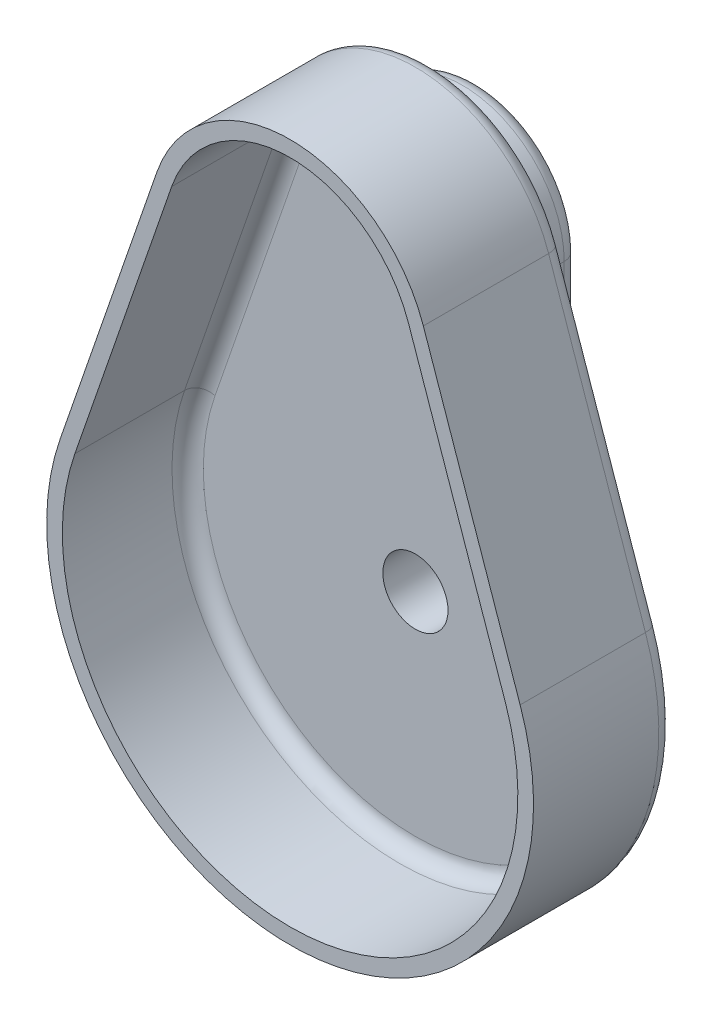
ISO-10303-21;
HEADER;
FILE_DESCRIPTION(('STEP AP214'),'2;1');
FILE_NAME('part.step','',(''),(''),'','','');
FILE_SCHEMA(('AUTOMOTIVE_DESIGN { 1 0 10303 214 1 1 1 1 }'));
ENDSEC;
DATA;
#1=APPLICATION_CONTEXT('core data for automotive mechanical design processes');
#2=APPLICATION_PROTOCOL_DEFINITION('international standard','automotive_design',2000,#1);
#3=PRODUCT_CONTEXT('',#1,'mechanical');
#4=PRODUCT('Part','Part','',(#3));
#5=PRODUCT_RELATED_PRODUCT_CATEGORY('part','',(#4));
#6=PRODUCT_DEFINITION_FORMATION('','',#4);
#7=PRODUCT_DEFINITION_CONTEXT('part definition',#1,'design');
#8=PRODUCT_DEFINITION('design','',#6,#7);
#9=PRODUCT_DEFINITION_SHAPE('','',#8);
#10=(LENGTH_UNIT() NAMED_UNIT(*) SI_UNIT(.MILLI.,.METRE.));
#11=(NAMED_UNIT(*) PLANE_ANGLE_UNIT() SI_UNIT($,.RADIAN.));
#12=(NAMED_UNIT(*) SI_UNIT($,.STERADIAN.) SOLID_ANGLE_UNIT());
#13=UNCERTAINTY_MEASURE_WITH_UNIT(LENGTH_MEASURE(1.E-05),#10,'distance_accuracy_value','');
#14=(GEOMETRIC_REPRESENTATION_CONTEXT(3) GLOBAL_UNCERTAINTY_ASSIGNED_CONTEXT((#13)) GLOBAL_UNIT_ASSIGNED_CONTEXT((#10,
#11,#12)) REPRESENTATION_CONTEXT('',''));
#15=CARTESIAN_POINT('',(0.,0.,0.));
#16=DIRECTION('',(0.,0.,1.));
#17=DIRECTION('',(1.,0.,0.));
#18=AXIS2_PLACEMENT_3D('',#15,#16,#17);
#19=CARTESIAN_POINT('',(0.,31.75,6.35));
#20=DIRECTION('',(0.,0.,-1.));
#21=DIRECTION('',(-1.,0.,0.));
#22=AXIS2_PLACEMENT_3D('',#19,#20,#21);
#23=CYLINDRICAL_SURFACE('',#22,10.31875);
#24=DIRECTION('',(0.,0.,-1.));
#25=VECTOR('',#24,1.);
#26=CARTESIAN_POINT('',(10.31875,31.75,6.35));
#27=LINE('',#26,#25);
#28=CARTESIAN_POINT('',(10.31875,31.75,3.175));
#29=VERTEX_POINT('',#28);
#30=CARTESIAN_POINT('',(10.31875,31.75,1.5875));
#31=VERTEX_POINT('',#30);
#32=EDGE_CURVE('E251',#29,#31,#27,.T.);
#33=ORIENTED_EDGE('',*,*,#32,.T.);
#34=CARTESIAN_POINT('',(0.,31.75,1.5875));
#35=DIRECTION('',(0.,0.,1.));
#36=DIRECTION('',(1.,0.,0.));
#37=AXIS2_PLACEMENT_3D('',#34,#35,#36);
#38=CIRCLE('',#37,10.31875);
#39=CARTESIAN_POINT('',(-10.31875,31.75,1.5875));
#40=VERTEX_POINT('',#39);
#41=EDGE_CURVE('E356',#31,#40,#38,.T.);
#42=ORIENTED_EDGE('',*,*,#41,.T.);
#43=DIRECTION('',(0.,0.,-1.));
#44=VECTOR('',#43,1.);
#45=CARTESIAN_POINT('',(-10.31875,31.75,6.35));
#46=LINE('',#45,#44);
#47=CARTESIAN_POINT('',(-10.31875,31.75,3.175));
#48=VERTEX_POINT('',#47);
#49=EDGE_CURVE('E259',#48,#40,#46,.T.);
#50=ORIENTED_EDGE('',*,*,#49,.F.);
#51=CARTESIAN_POINT('',(0.,31.75,3.175));
#52=DIRECTION('',(0.,0.,1.));
#53=DIRECTION('',(1.,0.,0.));
#54=AXIS2_PLACEMENT_3D('',#51,#52,#53);
#55=CIRCLE('',#54,10.31875);
#56=EDGE_CURVE('E307',#48,#29,#55,.F.);
#57=ORIENTED_EDGE('',*,*,#56,.T.);
#58=EDGE_LOOP('',(#33,#42,#50,#57));
#59=FACE_BOUND('',#58,.T.);
#60=ADVANCED_FACE('F46',(#59),#23,.T.);
#61=CARTESIAN_POINT('',(-10.31875,31.75,6.35));
#62=DIRECTION('',(1.,0.,0.));
#63=DIRECTION('',(0.,1.,0.));
#64=AXIS2_PLACEMENT_3D('',#61,#62,#63);
#65=PLANE('',#64);
#66=ORIENTED_EDGE('',*,*,#49,.T.);
#67=DIRECTION('',(0.,-1.,0.));
#68=VECTOR('',#67,1.);
#69=CARTESIAN_POINT('',(-10.31875,31.75,1.5875));
#70=LINE('',#69,#68);
#71=CARTESIAN_POINT('',(-10.31875,0.,1.5875));
#72=VERTEX_POINT('',#71);
#73=EDGE_CURVE('E315',#40,#72,#70,.T.);
#74=ORIENTED_EDGE('',*,*,#73,.T.);
#75=DIRECTION('',(0.,0.,-1.));
#76=VECTOR('',#75,1.);
#77=CARTESIAN_POINT('',(-10.31875,0.,6.35));
#78=LINE('',#77,#76);
#79=CARTESIAN_POINT('',(-10.31875,0.,3.175));
#80=VERTEX_POINT('',#79);
#81=EDGE_CURVE('E257',#80,#72,#78,.T.);
#82=ORIENTED_EDGE('',*,*,#81,.F.);
#83=DIRECTION('',(0.,-1.,0.));
#84=VECTOR('',#83,1.);
#85=CARTESIAN_POINT('',(-10.31875,31.75,3.175));
#86=LINE('',#85,#84);
#87=EDGE_CURVE('E305',#80,#48,#86,.F.);
#88=ORIENTED_EDGE('',*,*,#87,.T.);
#89=EDGE_LOOP('',(#66,#74,#82,#88));
#90=FACE_BOUND('',#89,.T.);
#91=ADVANCED_FACE('F387',(#90),#65,.F.);
#92=CARTESIAN_POINT('',(0.,0.,6.35));
#93=DIRECTION('',(0.,0.,-1.));
#94=DIRECTION('',(-1.,0.,0.));
#95=AXIS2_PLACEMENT_3D('',#92,#93,#94);
#96=CYLINDRICAL_SURFACE('',#95,10.31875);
#97=ORIENTED_EDGE('',*,*,#81,.T.);
#98=CARTESIAN_POINT('',(0.,0.,1.5875));
#99=DIRECTION('',(0.,0.,1.));
#100=DIRECTION('',(1.,0.,0.));
#101=AXIS2_PLACEMENT_3D('',#98,#99,#100);
#102=CIRCLE('',#101,10.31875);
#103=CARTESIAN_POINT('',(10.31875,0.,1.5875));
#104=VERTEX_POINT('',#103);
#105=EDGE_CURVE('E13',#72,#104,#102,.T.);
#106=ORIENTED_EDGE('',*,*,#105,.T.);
#107=DIRECTION('',(0.,0.,-1.));
#108=VECTOR('',#107,1.);
#109=CARTESIAN_POINT('',(10.31875,0.,6.35));
#110=LINE('',#109,#108);
#111=CARTESIAN_POINT('',(10.31875,0.,3.175));
#112=VERTEX_POINT('',#111);
#113=EDGE_CURVE('E255',#112,#104,#110,.T.);
#114=ORIENTED_EDGE('',*,*,#113,.F.);
#115=CARTESIAN_POINT('',(0.,0.,3.175));
#116=DIRECTION('',(0.,0.,1.));
#117=DIRECTION('',(1.,0.,0.));
#118=AXIS2_PLACEMENT_3D('',#115,#116,#117);
#119=CIRCLE('',#118,10.31875);
#120=EDGE_CURVE('E302',#112,#80,#119,.F.);
#121=ORIENTED_EDGE('',*,*,#120,.T.);
#122=EDGE_LOOP('',(#97,#106,#114,#121));
#123=FACE_BOUND('',#122,.T.);
#124=ADVANCED_FACE('F389',(#123),#96,.T.);
#125=CARTESIAN_POINT('',(10.31875,31.75,6.35));
#126=DIRECTION('',(-1.,0.,0.));
#127=DIRECTION('',(0.,-1.,0.));
#128=AXIS2_PLACEMENT_3D('',#125,#126,#127);
#129=PLANE('',#128);
#130=ORIENTED_EDGE('',*,*,#113,.T.);
#131=DIRECTION('',(0.,1.,0.));
#132=VECTOR('',#131,1.);
#133=CARTESIAN_POINT('',(10.31875,31.75,1.5875));
#134=LINE('',#133,#132);
#135=EDGE_CURVE('E55',#104,#31,#134,.T.);
#136=ORIENTED_EDGE('',*,*,#135,.T.);
#137=ORIENTED_EDGE('',*,*,#32,.F.);
#138=DIRECTION('',(0.,1.,0.));
#139=VECTOR('',#138,1.);
#140=CARTESIAN_POINT('',(10.31875,0.,3.175));
#141=LINE('',#140,#139);
#142=EDGE_CURVE('E313',#29,#112,#141,.F.);
#143=ORIENTED_EDGE('',*,*,#142,.T.);
#144=EDGE_LOOP('',(#130,#136,#137,#143));
#145=FACE_BOUND('',#144,.T.);
#146=ADVANCED_FACE('F661',(#145),#129,.F.);
#147=CARTESIAN_POINT('',(0.,31.75,6.35));
#148=DIRECTION('',(0.,0.,1.));
#149=DIRECTION('',(1.,0.,0.));
#150=AXIS2_PLACEMENT_3D('',#147,#148,#149);
#151=PLANE('',#150);
#152=CARTESIAN_POINT('',(9.08290304807061E-12,31.7500000000605,6.35));
#153=DIRECTION('',(0.,0.,1.));
#154=DIRECTION('',(1.,0.,0.));
#155=AXIS2_PLACEMENT_3D('',#152,#153,#154);
#156=CIRCLE('',#155,11.1125000000002);
#157=CARTESIAN_POINT('',(10.5015829594927,35.3837875000508,6.35));
#158=VERTEX_POINT('',#157);
#159=CARTESIAN_POINT('',(-10.5015829594726,35.3837875000566,6.35));
#160=VERTEX_POINT('',#159);
#161=EDGE_CURVE('E266',#158,#160,#156,.T.);
#162=ORIENTED_EDGE('',*,*,#161,.T.);
#163=DIRECTION('',(-0.326999999999642,-0.945024338311048,0.));
#164=VECTOR('',#163,1.);
#165=CARTESIAN_POINT('',(-20.3130618959114,7.02878324999242,6.35));
#166=LINE('',#165,#164);
#167=CARTESIAN_POINT('',(-20.3130618959114,7.02878324999241,6.35));
#168=VERTEX_POINT('',#167);
#169=EDGE_CURVE('E268',#160,#168,#166,.T.);
#170=ORIENTED_EDGE('',*,*,#169,.T.);
#171=CARTESIAN_POINT('',(0.,0.,6.35));
#172=DIRECTION('',(0.,0.,1.));
#173=DIRECTION('',(1.,0.,0.));
#174=AXIS2_PLACEMENT_3D('',#171,#172,#173);
#175=CIRCLE('',#174,21.49475);
#176=CARTESIAN_POINT('',(20.3130618959155,7.02878324998056,6.35));
#177=VERTEX_POINT('',#176);
#178=EDGE_CURVE('E262',#168,#177,#175,.T.);
#179=ORIENTED_EDGE('',*,*,#178,.T.);
#180=DIRECTION('',(-0.326999999999102,0.945024338311235,0.));
#181=VECTOR('',#180,1.);
#182=CARTESIAN_POINT('',(10.5015829594927,35.3837875000509,6.35));
#183=LINE('',#182,#181);
#184=EDGE_CURVE('E264',#177,#158,#183,.T.);
#185=ORIENTED_EDGE('',*,*,#184,.T.);
#186=EDGE_LOOP('',(#162,#170,#179,#185));
#187=FACE_BOUND('',#186,.T.);
#188=CARTESIAN_POINT('',(0.,0.,6.35));
#189=DIRECTION('',(0.,0.,1.));
#190=DIRECTION('',(1.,0.,0.));
#191=AXIS2_PLACEMENT_3D('',#188,#189,#190);
#192=CIRCLE('',#191,3.302);
#193=CARTESIAN_POINT('',(3.302,0.,6.35));
#194=VERTEX_POINT('',#193);
#195=EDGE_CURVE('E248',#194,#194,#192,.T.);
#196=ORIENTED_EDGE('',*,*,#195,.F.);
#197=EDGE_LOOP('',(#196));
#198=FACE_BOUND('',#197,.T.);
#199=CARTESIAN_POINT('',(0.,31.75,6.35));
#200=DIRECTION('',(0.,0.,1.));
#201=DIRECTION('',(1.,0.,0.));
#202=AXIS2_PLACEMENT_3D('',#199,#200,#201);
#203=CIRCLE('',#202,3.302);
#204=CARTESIAN_POINT('',(3.302,31.75,6.35));
#205=VERTEX_POINT('',#204);
#206=EDGE_CURVE('E242',#205,#205,#203,.T.);
#207=ORIENTED_EDGE('',*,*,#206,.F.);
#208=EDGE_LOOP('',(#207));
#209=FACE_BOUND('',#208,.T.);
#210=ADVANCED_FACE('F658',(#187,#198,#209),#151,.T.);
#211=CARTESIAN_POINT('',(0.,31.75,0.));
#212=DIRECTION('',(0.,0.,1.));
#213=DIRECTION('',(1.,0.,0.));
#214=AXIS2_PLACEMENT_3D('',#211,#212,#213);
#215=PLANE('',#214);
#216=CARTESIAN_POINT('',(0.,0.,0.));
#217=DIRECTION('',(0.,0.,1.));
#218=DIRECTION('',(1.,0.,0.));
#219=AXIS2_PLACEMENT_3D('',#216,#217,#218);
#220=CIRCLE('',#219,8.73125);
#221=CARTESIAN_POINT('',(8.73125,0.,0.));
#222=VERTEX_POINT('',#221);
#223=CARTESIAN_POINT('',(-8.73125,0.,0.));
#224=VERTEX_POINT('',#223);
#225=EDGE_CURVE('E347',#222,#224,#220,.F.);
#226=ORIENTED_EDGE('',*,*,#225,.T.);
#227=DIRECTION('',(0.,-1.,0.));
#228=VECTOR('',#227,1.);
#229=CARTESIAN_POINT('',(-8.73125,31.75,0.));
#230=LINE('',#229,#228);
#231=CARTESIAN_POINT('',(-8.73125,31.75,0.));
#232=VERTEX_POINT('',#231);
#233=EDGE_CURVE('E353',#224,#232,#230,.F.);
#234=ORIENTED_EDGE('',*,*,#233,.T.);
#235=CARTESIAN_POINT('',(0.,31.75,0.));
#236=DIRECTION('',(0.,0.,1.));
#237=DIRECTION('',(1.,0.,0.));
#238=AXIS2_PLACEMENT_3D('',#235,#236,#237);
#239=CIRCLE('',#238,8.73125);
#240=CARTESIAN_POINT('',(8.73125,31.75,0.));
#241=VERTEX_POINT('',#240);
#242=EDGE_CURVE('E351',#232,#241,#239,.F.);
#243=ORIENTED_EDGE('',*,*,#242,.T.);
#244=DIRECTION('',(0.,1.,0.));
#245=VECTOR('',#244,1.);
#246=CARTESIAN_POINT('',(8.73125,31.75,0.));
#247=LINE('',#246,#245);
#248=EDGE_CURVE('E349',#241,#222,#247,.F.);
#249=ORIENTED_EDGE('',*,*,#248,.T.);
#250=EDGE_LOOP('',(#226,#234,#243,#249));
#251=FACE_BOUND('',#250,.T.);
#252=CARTESIAN_POINT('',(0.,0.,0.));
#253=DIRECTION('',(0.,0.,1.));
#254=DIRECTION('',(1.,0.,0.));
#255=AXIS2_PLACEMENT_3D('',#252,#253,#254);
#256=CIRCLE('',#255,3.302);
#257=CARTESIAN_POINT('',(3.302,0.,0.));
#258=VERTEX_POINT('',#257);
#259=EDGE_CURVE('E245',#258,#258,#256,.T.);
#260=ORIENTED_EDGE('',*,*,#259,.T.);
#261=EDGE_LOOP('',(#260));
#262=FACE_BOUND('',#261,.T.);
#263=CARTESIAN_POINT('',(0.,31.75,0.));
#264=DIRECTION('',(0.,0.,1.));
#265=DIRECTION('',(1.,0.,0.));
#266=AXIS2_PLACEMENT_3D('',#263,#264,#265);
#267=CIRCLE('',#266,3.302);
#268=CARTESIAN_POINT('',(3.302,31.75,0.));
#269=VERTEX_POINT('',#268);
#270=EDGE_CURVE('E236',#269,#269,#267,.T.);
#271=ORIENTED_EDGE('',*,*,#270,.T.);
#272=EDGE_LOOP('',(#271));
#273=FACE_BOUND('',#272,.T.);
#274=ADVANCED_FACE('F377',(#251,#262,#273),#215,.F.);
#275=CARTESIAN_POINT('',(0.,0.,6.35));
#276=DIRECTION('',(0.,0.,-1.));
#277=DIRECTION('',(-1.,0.,0.));
#278=AXIS2_PLACEMENT_3D('',#275,#276,#277);
#279=CYLINDRICAL_SURFACE('',#278,3.302);
#280=ORIENTED_EDGE('',*,*,#195,.T.);
#281=EDGE_LOOP('',(#280));
#282=FACE_BOUND('',#281,.T.);
#283=ORIENTED_EDGE('',*,*,#259,.F.);
#284=EDGE_LOOP('',(#283));
#285=FACE_BOUND('',#284,.T.);
#286=ADVANCED_FACE('F676',(#282,#285),#279,.F.);
#287=CARTESIAN_POINT('',(0.,31.75,6.35));
#288=DIRECTION('',(0.,0.,-1.));
#289=DIRECTION('',(-1.,0.,0.));
#290=AXIS2_PLACEMENT_3D('',#287,#288,#289);
#291=CYLINDRICAL_SURFACE('',#290,3.302);
#292=ORIENTED_EDGE('',*,*,#206,.T.);
#293=EDGE_LOOP('',(#292));
#294=FACE_BOUND('',#293,.T.);
#295=ORIENTED_EDGE('',*,*,#270,.F.);
#296=EDGE_LOOP('',(#295));
#297=FACE_BOUND('',#296,.T.);
#298=ADVANCED_FACE('F650',(#294,#297),#291,.F.);
#299=CARTESIAN_POINT('',(9.08290304807061E-12,31.7500000000605,4.7625));
#300=DIRECTION('',(0.,0.,1.));
#301=DIRECTION('',(1.,0.,0.));
#302=AXIS2_PLACEMENT_3D('',#299,#300,#301);
#303=PLANE('',#302);
#304=CARTESIAN_POINT('',(0.,0.,4.7625));
#305=DIRECTION('',(0.,0.,1.));
#306=DIRECTION('',(1.,0.,0.));
#307=AXIS2_PLACEMENT_3D('',#304,#305,#306);
#308=CIRCLE('',#307,23.08225);
#309=CARTESIAN_POINT('',(21.8132880329845,7.54789574997914,4.7625));
#310=VERTEX_POINT('',#309);
#311=CARTESIAN_POINT('',(-21.8132880329802,7.54789574999185,4.7625));
#312=VERTEX_POINT('',#311);
#313=EDGE_CURVE('E289',#310,#312,#308,.F.);
#314=ORIENTED_EDGE('',*,*,#313,.T.);
#315=DIRECTION('',(-0.326999999999647,-0.945024338311046,0.));
#316=VECTOR('',#315,1.);
#317=CARTESIAN_POINT('',(-12.0018090965412,35.902900000056,4.7625));
#318=LINE('',#317,#316);
#319=CARTESIAN_POINT('',(-12.0018090965414,35.9029000000561,4.7625));
#320=VERTEX_POINT('',#319);
#321=EDGE_CURVE('E295',#312,#320,#318,.F.);
#322=ORIENTED_EDGE('',*,*,#321,.T.);
#323=CARTESIAN_POINT('',(9.08290304807061E-12,31.7500000000605,4.7625));
#324=DIRECTION('',(0.,0.,1.));
#325=DIRECTION('',(1.,0.,0.));
#326=AXIS2_PLACEMENT_3D('',#323,#324,#325);
#327=CIRCLE('',#326,12.7000000000002);
#328=CARTESIAN_POINT('',(12.001809096562,35.9029000000495,4.7625));
#329=VERTEX_POINT('',#328);
#330=EDGE_CURVE('E293',#320,#329,#327,.F.);
#331=ORIENTED_EDGE('',*,*,#330,.T.);
#332=DIRECTION('',(-0.326999999999097,0.945024338311237,0.));
#333=VECTOR('',#332,1.);
#334=CARTESIAN_POINT('',(21.8132880329845,7.54789574997914,4.7625));
#335=LINE('',#334,#333);
#336=EDGE_CURVE('E291',#329,#310,#335,.F.);
#337=ORIENTED_EDGE('',*,*,#336,.T.);
#338=EDGE_LOOP('',(#314,#322,#331,#337));
#339=FACE_BOUND('',#338,.T.);
#340=DIRECTION('',(0.,-1.,0.));
#341=VECTOR('',#340,1.);
#342=CARTESIAN_POINT('',(-11.90625,0.,4.7625));
#343=LINE('',#342,#341);
#344=CARTESIAN_POINT('',(-11.90625,31.75,4.7625));
#345=VERTEX_POINT('',#344);
#346=CARTESIAN_POINT('',(-11.90625,0.,4.7625));
#347=VERTEX_POINT('',#346);
#348=EDGE_CURVE('E284',#345,#347,#343,.T.);
#349=ORIENTED_EDGE('',*,*,#348,.T.);
#350=CARTESIAN_POINT('',(0.,0.,4.7625));
#351=DIRECTION('',(0.,0.,1.));
#352=DIRECTION('',(1.,0.,0.));
#353=AXIS2_PLACEMENT_3D('',#350,#351,#352);
#354=CIRCLE('',#353,11.90625);
#355=CARTESIAN_POINT('',(11.90625,0.,4.7625));
#356=VERTEX_POINT('',#355);
#357=EDGE_CURVE('E286',#347,#356,#354,.T.);
#358=ORIENTED_EDGE('',*,*,#357,.T.);
#359=DIRECTION('',(0.,1.,0.));
#360=VECTOR('',#359,1.);
#361=CARTESIAN_POINT('',(11.90625,31.75,4.7625));
#362=LINE('',#361,#360);
#363=CARTESIAN_POINT('',(11.90625,31.75,4.7625));
#364=VERTEX_POINT('',#363);
#365=EDGE_CURVE('E280',#356,#364,#362,.T.);
#366=ORIENTED_EDGE('',*,*,#365,.T.);
#367=CARTESIAN_POINT('',(0.,31.75,4.7625));
#368=DIRECTION('',(0.,0.,1.));
#369=DIRECTION('',(1.,0.,0.));
#370=AXIS2_PLACEMENT_3D('',#367,#368,#369);
#371=CIRCLE('',#370,11.90625);
#372=EDGE_CURVE('E282',#364,#345,#371,.T.);
#373=ORIENTED_EDGE('',*,*,#372,.T.);
#374=EDGE_LOOP('',(#349,#358,#366,#373));
#375=FACE_BOUND('',#374,.T.);
#376=ADVANCED_FACE('F404',(#339,#375),#303,.F.);
#377=CARTESIAN_POINT('',(9.08290304807061E-12,31.7500000000605,4.7625));
#378=DIRECTION('',(0.,0.,1.));
#379=DIRECTION('',(1.,0.,0.));
#380=AXIS2_PLACEMENT_3D('',#377,#378,#379);
#381=CYLINDRICAL_SURFACE('',#380,14.2875000000002);
#382=DIRECTION('',(0.,0.,1.));
#383=VECTOR('',#382,1.);
#384=CARTESIAN_POINT('',(13.502035233631,36.4220125000481,4.7625));
#385=LINE('',#384,#383);
#386=CARTESIAN_POINT('',(13.502035233631,36.4220125000481,6.35));
#387=VERTEX_POINT('',#386);
#388=CARTESIAN_POINT('',(13.5020352336309,36.422012500048,19.05));
#389=VERTEX_POINT('',#388);
#390=EDGE_CURVE('E234',#387,#389,#385,.T.);
#391=ORIENTED_EDGE('',*,*,#390,.F.);
#392=CARTESIAN_POINT('',(9.08290304807061E-12,31.7500000000605,6.35));
#393=DIRECTION('',(0.,0.,1.));
#394=DIRECTION('',(1.,0.,0.));
#395=AXIS2_PLACEMENT_3D('',#392,#393,#394);
#396=CIRCLE('',#395,14.2875000000002);
#397=CARTESIAN_POINT('',(-13.50203523361,36.4220125000555,6.35));
#398=VERTEX_POINT('',#397);
#399=EDGE_CURVE('E298',#387,#398,#396,.T.);
#400=ORIENTED_EDGE('',*,*,#399,.T.);
#401=DIRECTION('',(0.,0.,1.));
#402=VECTOR('',#401,1.);
#403=CARTESIAN_POINT('',(-13.50203523361,36.4220125000555,4.7625));
#404=LINE('',#403,#402);
#405=CARTESIAN_POINT('',(-13.5020352336101,36.4220125000555,19.05));
#406=VERTEX_POINT('',#405);
#407=EDGE_CURVE('E233',#398,#406,#404,.T.);
#408=ORIENTED_EDGE('',*,*,#407,.T.);
#409=CARTESIAN_POINT('',(9.08290304807061E-12,31.7500000000605,19.05));
#410=DIRECTION('',(0.,0.,1.));
#411=DIRECTION('',(1.,0.,0.));
#412=AXIS2_PLACEMENT_3D('',#409,#410,#411);
#413=CIRCLE('',#412,14.2875000000002);
#414=EDGE_CURVE('E205',#389,#406,#413,.T.);
#415=ORIENTED_EDGE('',*,*,#414,.F.);
#416=EDGE_LOOP('',(#391,#400,#408,#415));
#417=FACE_BOUND('',#416,.T.);
#418=ADVANCED_FACE('F629',(#417),#381,.T.);
#419=CARTESIAN_POINT('',(13.5020352336489,36.4220124999965,4.7625));
#420=DIRECTION('',(0.945024338311237,0.326999999999097,0.));
#421=DIRECTION('',(-0.326999999999097,0.945024338311237,0.));
#422=AXIS2_PLACEMENT_3D('',#419,#420,#421);
#423=PLANE('',#422);
#424=DIRECTION('',(0.,0.,1.));
#425=VECTOR('',#424,1.);
#426=CARTESIAN_POINT('',(23.3135141700536,8.0670082499777,4.7625));
#427=LINE('',#426,#425);
#428=CARTESIAN_POINT('',(23.3135141700536,8.0670082499777,6.35));
#429=VERTEX_POINT('',#428);
#430=CARTESIAN_POINT('',(23.3135141700536,8.06700824997771,19.05));
#431=VERTEX_POINT('',#430);
#432=EDGE_CURVE('E237',#429,#431,#427,.T.);
#433=ORIENTED_EDGE('',*,*,#432,.F.);
#434=DIRECTION('',(-0.326999999999097,0.945024338311237,0.));
#435=VECTOR('',#434,1.);
#436=CARTESIAN_POINT('',(13.502035233631,36.4220125000481,6.35));
#437=LINE('',#436,#435);
#438=EDGE_CURVE('E300',#429,#387,#437,.T.);
#439=ORIENTED_EDGE('',*,*,#438,.T.);
#440=ORIENTED_EDGE('',*,*,#390,.T.);
#441=DIRECTION('',(-0.326999999999101,0.945024338311235,0.));
#442=VECTOR('',#441,1.);
#443=CARTESIAN_POINT('',(23.3135141700536,8.06700824997771,19.05));
#444=LINE('',#443,#442);
#445=EDGE_CURVE('E230',#431,#389,#444,.T.);
#446=ORIENTED_EDGE('',*,*,#445,.F.);
#447=EDGE_LOOP('',(#433,#439,#440,#446));
#448=FACE_BOUND('',#447,.T.);
#449=ADVANCED_FACE('F618',(#448),#423,.T.);
#450=CARTESIAN_POINT('',(0.,0.,4.7625));
#451=DIRECTION('',(0.,0.,1.));
#452=DIRECTION('',(1.,0.,0.));
#453=AXIS2_PLACEMENT_3D('',#450,#451,#452);
#454=CYLINDRICAL_SURFACE('',#453,24.66975);
#455=DIRECTION('',(0.,0.,1.));
#456=VECTOR('',#455,1.);
#457=CARTESIAN_POINT('',(-23.3135141700489,8.06700824999128,4.7625));
#458=LINE('',#457,#456);
#459=CARTESIAN_POINT('',(-23.3135141700489,8.06700824999128,6.35));
#460=VERTEX_POINT('',#459);
#461=CARTESIAN_POINT('',(-23.3135141700489,8.06700824999128,19.05));
#462=VERTEX_POINT('',#461);
#463=EDGE_CURVE('E239',#460,#462,#458,.T.);
#464=ORIENTED_EDGE('',*,*,#463,.F.);
#465=CARTESIAN_POINT('',(0.,0.,6.35));
#466=DIRECTION('',(0.,0.,1.));
#467=DIRECTION('',(1.,0.,0.));
#468=AXIS2_PLACEMENT_3D('',#465,#466,#467);
#469=CIRCLE('',#468,24.66975);
#470=EDGE_CURVE('E311',#460,#429,#469,.T.);
#471=ORIENTED_EDGE('',*,*,#470,.T.);
#472=ORIENTED_EDGE('',*,*,#432,.T.);
#473=CARTESIAN_POINT('',(0.,0.,19.05));
#474=DIRECTION('',(0.,0.,1.));
#475=DIRECTION('',(1.,0.,0.));
#476=AXIS2_PLACEMENT_3D('',#473,#474,#475);
#477=CIRCLE('',#476,24.66975);
#478=EDGE_CURVE('E227',#462,#431,#477,.T.);
#479=ORIENTED_EDGE('',*,*,#478,.F.);
#480=EDGE_LOOP('',(#464,#471,#472,#479));
#481=FACE_BOUND('',#480,.T.);
#482=ADVANCED_FACE('F605',(#481),#454,.T.);
#483=CARTESIAN_POINT('',(-13.5020352336297,36.4220124999986,4.7625));
#484=DIRECTION('',(-0.945024338311046,0.326999999999647,0.));
#485=DIRECTION('',(-0.326999999999647,-0.945024338311046,0.));
#486=AXIS2_PLACEMENT_3D('',#483,#484,#485);
#487=PLANE('',#486);
#488=ORIENTED_EDGE('',*,*,#407,.F.);
#489=DIRECTION('',(-0.326999999999647,-0.945024338311046,0.));
#490=VECTOR('',#489,1.);
#491=CARTESIAN_POINT('',(-23.3135141700489,8.06700824999129,6.35));
#492=LINE('',#491,#490);
#493=EDGE_CURVE('E277',#398,#460,#492,.T.);
#494=ORIENTED_EDGE('',*,*,#493,.T.);
#495=ORIENTED_EDGE('',*,*,#463,.T.);
#496=DIRECTION('',(-0.326999999999642,-0.945024338311048,0.));
#497=VECTOR('',#496,1.);
#498=CARTESIAN_POINT('',(-13.5020352336101,36.4220125000555,19.05));
#499=LINE('',#498,#497);
#500=EDGE_CURVE('E224',#406,#462,#499,.T.);
#501=ORIENTED_EDGE('',*,*,#500,.F.);
#502=EDGE_LOOP('',(#488,#494,#495,#501));
#503=FACE_BOUND('',#502,.T.);
#504=ADVANCED_FACE('F594',(#503),#487,.T.);
#505=CARTESIAN_POINT('',(9.08290304807061E-12,31.7500000000605,19.05));
#506=DIRECTION('',(0.,0.,1.));
#507=DIRECTION('',(1.,0.,0.));
#508=AXIS2_PLACEMENT_3D('',#505,#506,#507);
#509=PLANE('',#508);
#510=ORIENTED_EDGE('',*,*,#414,.T.);
#511=ORIENTED_EDGE('',*,*,#500,.T.);
#512=ORIENTED_EDGE('',*,*,#478,.T.);
#513=ORIENTED_EDGE('',*,*,#445,.T.);
#514=EDGE_LOOP('',(#510,#511,#512,#513));
#515=FACE_BOUND('',#514,.T.);
#516=DIRECTION('',(-0.326999999999101,0.945024338311235,0.));
#517=VECTOR('',#516,1.);
#518=CARTESIAN_POINT('',(21.8132880329845,7.54789574997914,19.05));
#519=LINE('',#518,#517);
#520=CARTESIAN_POINT('',(21.8132880329845,7.54789574997914,19.05));
#521=VERTEX_POINT('',#520);
#522=CARTESIAN_POINT('',(12.0018090965618,35.9029000000494,19.05));
#523=VERTEX_POINT('',#522);
#524=EDGE_CURVE('E196',#521,#523,#519,.T.);
#525=ORIENTED_EDGE('',*,*,#524,.F.);
#526=CARTESIAN_POINT('',(0.,0.,19.05));
#527=DIRECTION('',(0.,0.,1.));
#528=DIRECTION('',(1.,0.,0.));
#529=AXIS2_PLACEMENT_3D('',#526,#527,#528);
#530=CIRCLE('',#529,23.08225);
#531=CARTESIAN_POINT('',(-21.8132880329802,7.54789574999184,19.05));
#532=VERTEX_POINT('',#531);
#533=EDGE_CURVE('E186',#532,#521,#530,.T.);
#534=ORIENTED_EDGE('',*,*,#533,.F.);
#535=DIRECTION('',(-0.326999999999642,-0.945024338311048,0.));
#536=VECTOR('',#535,1.);
#537=CARTESIAN_POINT('',(-12.0018090965414,35.9029000000561,19.05));
#538=LINE('',#537,#536);
#539=CARTESIAN_POINT('',(-12.0018090965414,35.9029000000561,19.05));
#540=VERTEX_POINT('',#539);
#541=EDGE_CURVE('E213',#540,#532,#538,.T.);
#542=ORIENTED_EDGE('',*,*,#541,.F.);
#543=CARTESIAN_POINT('',(9.08290304807061E-12,31.7500000000605,19.05));
#544=DIRECTION('',(0.,0.,1.));
#545=DIRECTION('',(1.,0.,0.));
#546=AXIS2_PLACEMENT_3D('',#543,#544,#545);
#547=CIRCLE('',#546,12.7000000000002);
#548=EDGE_CURVE('E211',#523,#540,#547,.T.);
#549=ORIENTED_EDGE('',*,*,#548,.F.);
#550=EDGE_LOOP('',(#525,#534,#542,#549));
#551=FACE_BOUND('',#550,.T.);
#552=ADVANCED_FACE('F209',(#515,#551),#509,.T.);
#553=CARTESIAN_POINT('',(0.,0.,19.05));
#554=DIRECTION('',(0.,0.,-1.));
#555=DIRECTION('',(-1.,0.,0.));
#556=AXIS2_PLACEMENT_3D('',#553,#554,#555);
#557=CYLINDRICAL_SURFACE('',#556,23.08225);
#558=DIRECTION('',(0.,0.,-1.));
#559=VECTOR('',#558,1.);
#560=CARTESIAN_POINT('',(21.8132880329845,7.54789574997914,19.05));
#561=LINE('',#560,#559);
#562=CARTESIAN_POINT('',(21.8132880329845,7.54789574997914,7.9375));
#563=VERTEX_POINT('',#562);
#564=EDGE_CURVE('E189',#521,#563,#561,.T.);
#565=ORIENTED_EDGE('',*,*,#564,.T.);
#566=CARTESIAN_POINT('',(0.,0.,7.9375));
#567=DIRECTION('',(0.,0.,1.));
#568=DIRECTION('',(1.,0.,0.));
#569=AXIS2_PLACEMENT_3D('',#566,#567,#568);
#570=CIRCLE('',#569,23.08225);
#571=CARTESIAN_POINT('',(-21.8132880329802,7.54789574999184,7.9375));
#572=VERTEX_POINT('',#571);
#573=EDGE_CURVE('E309',#563,#572,#570,.F.);
#574=ORIENTED_EDGE('',*,*,#573,.T.);
#575=DIRECTION('',(0.,0.,-1.));
#576=VECTOR('',#575,1.);
#577=CARTESIAN_POINT('',(-21.8132880329802,7.54789574999184,19.05));
#578=LINE('',#577,#576);
#579=EDGE_CURVE('E192',#532,#572,#578,.T.);
#580=ORIENTED_EDGE('',*,*,#579,.F.);
#581=ORIENTED_EDGE('',*,*,#533,.T.);
#582=EDGE_LOOP('',(#565,#574,#580,#581));
#583=FACE_BOUND('',#582,.T.);
#584=ADVANCED_FACE('F188',(#583),#557,.F.);
#585=CARTESIAN_POINT('',(21.8132880329845,7.54789574997914,19.05));
#586=DIRECTION('',(-0.945024338311235,-0.326999999999102,0.));
#587=DIRECTION('',(0.326999999999102,-0.945024338311235,0.));
#588=AXIS2_PLACEMENT_3D('',#585,#586,#587);
#589=PLANE('',#588);
#590=DIRECTION('',(0.,0.,-1.));
#591=VECTOR('',#590,1.);
#592=CARTESIAN_POINT('',(12.0018090965618,35.9029000000494,19.05));
#593=LINE('',#592,#591);
#594=CARTESIAN_POINT('',(12.0018090965618,35.9029000000494,7.9375));
#595=VERTEX_POINT('',#594);
#596=EDGE_CURVE('E206',#523,#595,#593,.T.);
#597=ORIENTED_EDGE('',*,*,#596,.T.);
#598=DIRECTION('',(-0.326999999999102,0.945024338311235,0.));
#599=VECTOR('',#598,1.);
#600=CARTESIAN_POINT('',(21.8132880329845,7.54789574997913,7.9375));
#601=LINE('',#600,#599);
#602=EDGE_CURVE('E204',#595,#563,#601,.F.);
#603=ORIENTED_EDGE('',*,*,#602,.T.);
#604=ORIENTED_EDGE('',*,*,#564,.F.);
#605=ORIENTED_EDGE('',*,*,#524,.T.);
#606=EDGE_LOOP('',(#597,#603,#604,#605));
#607=FACE_BOUND('',#606,.T.);
#608=ADVANCED_FACE('F201',(#607),#589,.T.);
#609=CARTESIAN_POINT('',(9.08290304807061E-12,31.7500000000605,19.05));
#610=DIRECTION('',(0.,0.,-1.));
#611=DIRECTION('',(-1.,0.,0.));
#612=AXIS2_PLACEMENT_3D('',#609,#610,#611);
#613=CYLINDRICAL_SURFACE('',#612,12.7000000000002);
#614=DIRECTION('',(0.,0.,-1.));
#615=VECTOR('',#614,1.);
#616=CARTESIAN_POINT('',(-12.0018090965414,35.9029000000561,19.05));
#617=LINE('',#616,#615);
#618=CARTESIAN_POINT('',(-12.0018090965414,35.9029000000561,7.9375));
#619=VERTEX_POINT('',#618);
#620=EDGE_CURVE('E218',#540,#619,#617,.T.);
#621=ORIENTED_EDGE('',*,*,#620,.T.);
#622=CARTESIAN_POINT('',(9.08290304807061E-12,31.7500000000605,7.9375));
#623=DIRECTION('',(0.,0.,1.));
#624=DIRECTION('',(1.,0.,0.));
#625=AXIS2_PLACEMENT_3D('',#622,#623,#624);
#626=CIRCLE('',#625,12.7000000000002);
#627=EDGE_CURVE('E274',#619,#595,#626,.F.);
#628=ORIENTED_EDGE('',*,*,#627,.T.);
#629=ORIENTED_EDGE('',*,*,#596,.F.);
#630=ORIENTED_EDGE('',*,*,#548,.T.);
#631=EDGE_LOOP('',(#621,#628,#629,#630));
#632=FACE_BOUND('',#631,.T.);
#633=ADVANCED_FACE('F562',(#632),#613,.F.);
#634=CARTESIAN_POINT('',(-12.0018090965414,35.9029000000561,19.05));
#635=DIRECTION('',(0.945024338311048,-0.326999999999642,0.));
#636=DIRECTION('',(0.326999999999642,0.945024338311048,0.));
#637=AXIS2_PLACEMENT_3D('',#634,#635,#636);
#638=PLANE('',#637);
#639=ORIENTED_EDGE('',*,*,#579,.T.);
#640=DIRECTION('',(-0.326999999999642,-0.945024338311048,0.));
#641=VECTOR('',#640,1.);
#642=CARTESIAN_POINT('',(-12.0018090965414,35.9029000000561,7.9375));
#643=LINE('',#642,#641);
#644=EDGE_CURVE('E271',#572,#619,#643,.F.);
#645=ORIENTED_EDGE('',*,*,#644,.T.);
#646=ORIENTED_EDGE('',*,*,#620,.F.);
#647=ORIENTED_EDGE('',*,*,#541,.T.);
#648=EDGE_LOOP('',(#639,#645,#646,#647));
#649=FACE_BOUND('',#648,.T.);
#650=ADVANCED_FACE('F448',(#649),#638,.T.);
#651=CARTESIAN_POINT('',(10.5015829595106,35.3837874999993,7.9375));
#652=DIRECTION('',(0.326999999999102,-0.945024338311235,0.));
#653=DIRECTION('',(0.945024338311235,0.326999999999102,0.));
#654=AXIS2_PLACEMENT_3D('',#651,#652,#653);
#655=CYLINDRICAL_SURFACE('',#654,1.5875);
#656=CARTESIAN_POINT('',(20.3130618959155,7.02878324998056,7.9375));
#657=DIRECTION('',(-0.326999999999101,0.945024338311235,0.));
#658=DIRECTION('',(-0.945024338311235,-0.326999999999101,0.));
#659=AXIS2_PLACEMENT_3D('',#656,#657,#658);
#660=CIRCLE('',#659,1.5875);
#661=EDGE_CURVE('E321',#563,#177,#660,.T.);
#662=ORIENTED_EDGE('',*,*,#661,.F.);
#663=ORIENTED_EDGE('',*,*,#602,.F.);
#664=CARTESIAN_POINT('',(10.5015829594927,35.3837875000508,7.9375));
#665=DIRECTION('',(0.326999999999122,-0.945024338311228,0.));
#666=DIRECTION('',(0.945024338311228,0.326999999999122,0.));
#667=AXIS2_PLACEMENT_3D('',#664,#665,#666);
#668=CIRCLE('',#667,1.5875);
#669=EDGE_CURVE('E197',#158,#595,#668,.T.);
#670=ORIENTED_EDGE('',*,*,#669,.F.);
#671=ORIENTED_EDGE('',*,*,#184,.F.);
#672=EDGE_LOOP('',(#662,#663,#670,#671));
#673=FACE_BOUND('',#672,.T.);
#674=ADVANCED_FACE('F445',(#673),#655,.F.);
#675=CARTESIAN_POINT('',(9.08290304807061E-12,31.7500000000605,7.9375));
#676=DIRECTION('',(0.,0.,1.));
#677=DIRECTION('',(1.,0.,0.));
#678=AXIS2_PLACEMENT_3D('',#675,#676,#677);
#679=TOROIDAL_SURFACE('',#678,11.1125000000002,1.5875);
#680=ORIENTED_EDGE('',*,*,#669,.T.);
#681=ORIENTED_EDGE('',*,*,#627,.F.);
#682=CARTESIAN_POINT('',(-10.5015829594726,35.3837875000566,7.9375));
#683=DIRECTION('',(0.326999999999643,0.945024338311048,0.));
#684=DIRECTION('',(-0.945024338311048,0.326999999999643,0.));
#685=AXIS2_PLACEMENT_3D('',#682,#683,#684);
#686=CIRCLE('',#685,1.5875);
#687=EDGE_CURVE('E318',#160,#619,#686,.T.);
#688=ORIENTED_EDGE('',*,*,#687,.F.);
#689=ORIENTED_EDGE('',*,*,#161,.F.);
#690=EDGE_LOOP('',(#680,#681,#688,#689));
#691=FACE_BOUND('',#690,.T.);
#692=ADVANCED_FACE('F441',(#691),#679,.F.);
#693=CARTESIAN_POINT('',(0.,0.,7.9375));
#694=DIRECTION('',(0.,0.,1.));
#695=DIRECTION('',(1.,0.,0.));
#696=AXIS2_PLACEMENT_3D('',#693,#694,#695);
#697=TOROIDAL_SURFACE('',#696,21.49475,1.5875);
#698=ORIENTED_EDGE('',*,*,#661,.T.);
#699=ORIENTED_EDGE('',*,*,#178,.F.);
#700=CARTESIAN_POINT('',(-20.3130618959114,7.02878324999241,7.9375));
#701=DIRECTION('',(-0.326999999999646,-0.945024338311046,0.));
#702=DIRECTION('',(0.945024338311046,-0.326999999999646,0.));
#703=AXIS2_PLACEMENT_3D('',#700,#701,#702);
#704=CIRCLE('',#703,1.5875);
#705=EDGE_CURVE('E316',#572,#168,#704,.T.);
#706=ORIENTED_EDGE('',*,*,#705,.F.);
#707=ORIENTED_EDGE('',*,*,#573,.F.);
#708=EDGE_LOOP('',(#698,#699,#706,#707));
#709=FACE_BOUND('',#708,.T.);
#710=ADVANCED_FACE('F437',(#709),#697,.F.);
#711=CARTESIAN_POINT('',(-10.5015829594923,35.3837874999997,7.9375));
#712=DIRECTION('',(0.326999999999642,0.945024338311048,0.));
#713=DIRECTION('',(-0.945024338311048,0.326999999999642,0.));
#714=AXIS2_PLACEMENT_3D('',#711,#712,#713);
#715=CYLINDRICAL_SURFACE('',#714,1.5875);
#716=ORIENTED_EDGE('',*,*,#687,.T.);
#717=ORIENTED_EDGE('',*,*,#644,.F.);
#718=ORIENTED_EDGE('',*,*,#705,.T.);
#719=ORIENTED_EDGE('',*,*,#169,.F.);
#720=EDGE_LOOP('',(#716,#717,#718,#719));
#721=FACE_BOUND('',#720,.T.);
#722=ADVANCED_FACE('F433',(#721),#715,.F.);
#723=CARTESIAN_POINT('',(12.0018090965798,35.9028999999979,6.35));
#724=DIRECTION('',(0.326999999999097,-0.945024338311237,0.));
#725=DIRECTION('',(0.945024338311237,0.326999999999097,0.));
#726=AXIS2_PLACEMENT_3D('',#723,#724,#725);
#727=CYLINDRICAL_SURFACE('',#726,1.5875);
#728=CARTESIAN_POINT('',(21.8132880329845,7.54789574997914,6.35));
#729=DIRECTION('',(0.326999999999096,-0.945024338311237,0.));
#730=DIRECTION('',(0.945024338311237,0.326999999999096,0.));
#731=AXIS2_PLACEMENT_3D('',#728,#729,#730);
#732=CIRCLE('',#731,1.5875);
#733=EDGE_CURVE('E331',#310,#429,#732,.T.);
#734=ORIENTED_EDGE('',*,*,#733,.F.);
#735=ORIENTED_EDGE('',*,*,#336,.F.);
#736=CARTESIAN_POINT('',(12.001809096562,35.9029000000495,6.35));
#737=DIRECTION('',(-0.326999999999096,0.945024338311237,0.));
#738=DIRECTION('',(-0.945024338311237,-0.326999999999096,0.));
#739=AXIS2_PLACEMENT_3D('',#736,#737,#738);
#740=CIRCLE('',#739,1.5875);
#741=EDGE_CURVE('E319',#387,#329,#740,.T.);
#742=ORIENTED_EDGE('',*,*,#741,.F.);
#743=ORIENTED_EDGE('',*,*,#438,.F.);
#744=EDGE_LOOP('',(#734,#735,#742,#743));
#745=FACE_BOUND('',#744,.T.);
#746=ADVANCED_FACE('F436',(#745),#727,.T.);
#747=CARTESIAN_POINT('',(9.08290304807061E-12,31.7500000000605,6.35));
#748=DIRECTION('',(0.,0.,1.));
#749=DIRECTION('',(1.,0.,0.));
#750=AXIS2_PLACEMENT_3D('',#747,#748,#749);
#751=TOROIDAL_SURFACE('',#750,12.7000000000002,1.5875);
#752=ORIENTED_EDGE('',*,*,#741,.T.);
#753=ORIENTED_EDGE('',*,*,#330,.F.);
#754=CARTESIAN_POINT('',(-12.0018090965414,35.9029000000561,6.35));
#755=DIRECTION('',(-0.326999999999647,-0.945024338311046,0.));
#756=DIRECTION('',(0.945024338311046,-0.326999999999647,0.));
#757=AXIS2_PLACEMENT_3D('',#754,#755,#756);
#758=CIRCLE('',#757,1.5875);
#759=EDGE_CURVE('E328',#398,#320,#758,.T.);
#760=ORIENTED_EDGE('',*,*,#759,.F.);
#761=ORIENTED_EDGE('',*,*,#399,.F.);
#762=EDGE_LOOP('',(#752,#753,#760,#761));
#763=FACE_BOUND('',#762,.T.);
#764=ADVANCED_FACE('F453',(#763),#751,.T.);
#765=CARTESIAN_POINT('',(0.,0.,6.35));
#766=DIRECTION('',(0.,0.,1.));
#767=DIRECTION('',(1.,0.,0.));
#768=AXIS2_PLACEMENT_3D('',#765,#766,#767);
#769=TOROIDAL_SURFACE('',#768,23.08225,1.5875);
#770=ORIENTED_EDGE('',*,*,#733,.T.);
#771=ORIENTED_EDGE('',*,*,#470,.F.);
#772=CARTESIAN_POINT('',(-21.8132880329802,7.54789574999185,6.35));
#773=DIRECTION('',(0.326999999999647,0.945024338311046,0.));
#774=DIRECTION('',(-0.945024338311047,0.326999999999647,0.));
#775=AXIS2_PLACEMENT_3D('',#772,#773,#774);
#776=CIRCLE('',#775,1.5875);
#777=EDGE_CURVE('E326',#312,#460,#776,.T.);
#778=ORIENTED_EDGE('',*,*,#777,.F.);
#779=ORIENTED_EDGE('',*,*,#313,.F.);
#780=EDGE_LOOP('',(#770,#771,#778,#779));
#781=FACE_BOUND('',#780,.T.);
#782=ADVANCED_FACE('F421',(#781),#769,.T.);
#783=CARTESIAN_POINT('',(-12.0018090965609,35.9028999999992,6.35));
#784=DIRECTION('',(0.326999999999647,0.945024338311046,0.));
#785=DIRECTION('',(-0.945024338311046,0.326999999999647,0.));
#786=AXIS2_PLACEMENT_3D('',#783,#784,#785);
#787=CYLINDRICAL_SURFACE('',#786,1.5875);
#788=ORIENTED_EDGE('',*,*,#759,.T.);
#789=ORIENTED_EDGE('',*,*,#321,.F.);
#790=ORIENTED_EDGE('',*,*,#777,.T.);
#791=ORIENTED_EDGE('',*,*,#493,.F.);
#792=EDGE_LOOP('',(#788,#789,#790,#791));
#793=FACE_BOUND('',#792,.T.);
#794=ADVANCED_FACE('F414',(#793),#787,.T.);
#795=CARTESIAN_POINT('',(0.,31.75,3.175));
#796=DIRECTION('',(0.,0.,1.));
#797=DIRECTION('',(1.,0.,0.));
#798=AXIS2_PLACEMENT_3D('',#795,#796,#797);
#799=TOROIDAL_SURFACE('',#798,11.90625,1.5875);
#800=CARTESIAN_POINT('',(11.90625,31.75,3.175));
#801=DIRECTION('',(0.,1.,0.));
#802=DIRECTION('',(0.,0.,1.));
#803=AXIS2_PLACEMENT_3D('',#800,#801,#802);
#804=CIRCLE('',#803,1.5875);
#805=EDGE_CURVE('E340',#29,#364,#804,.T.);
#806=ORIENTED_EDGE('',*,*,#805,.F.);
#807=ORIENTED_EDGE('',*,*,#56,.F.);
#808=CARTESIAN_POINT('',(-11.90625,31.75,3.175));
#809=DIRECTION('',(0.,1.,0.));
#810=DIRECTION('',(0.,0.,1.));
#811=AXIS2_PLACEMENT_3D('',#808,#809,#810);
#812=CIRCLE('',#811,1.5875);
#813=EDGE_CURVE('E329',#345,#48,#812,.T.);
#814=ORIENTED_EDGE('',*,*,#813,.F.);
#815=ORIENTED_EDGE('',*,*,#372,.F.);
#816=EDGE_LOOP('',(#806,#807,#814,#815));
#817=FACE_BOUND('',#816,.T.);
#818=ADVANCED_FACE('F412',(#817),#799,.F.);
#819=CARTESIAN_POINT('',(-11.90625,31.7500000000605,3.175));
#820=DIRECTION('',(0.,1.,0.));
#821=DIRECTION('',(-1.,0.,0.));
#822=AXIS2_PLACEMENT_3D('',#819,#820,#821);
#823=CYLINDRICAL_SURFACE('',#822,1.5875);
#824=ORIENTED_EDGE('',*,*,#813,.T.);
#825=ORIENTED_EDGE('',*,*,#87,.F.);
#826=CARTESIAN_POINT('',(-11.90625,0.,3.175));
#827=DIRECTION('',(0.,1.,0.));
#828=DIRECTION('',(-1.,0.,0.));
#829=AXIS2_PLACEMENT_3D('',#826,#827,#828);
#830=CIRCLE('',#829,1.5875);
#831=EDGE_CURVE('E338',#347,#80,#830,.T.);
#832=ORIENTED_EDGE('',*,*,#831,.F.);
#833=ORIENTED_EDGE('',*,*,#348,.F.);
#834=EDGE_LOOP('',(#824,#825,#832,#833));
#835=FACE_BOUND('',#834,.T.);
#836=ADVANCED_FACE('F408',(#835),#823,.F.);
#837=CARTESIAN_POINT('',(11.90625,31.7500000000605,3.175));
#838=DIRECTION('',(0.,-1.,0.));
#839=DIRECTION('',(1.,0.,0.));
#840=AXIS2_PLACEMENT_3D('',#837,#838,#839);
#841=CYLINDRICAL_SURFACE('',#840,1.5875);
#842=ORIENTED_EDGE('',*,*,#805,.T.);
#843=ORIENTED_EDGE('',*,*,#365,.F.);
#844=CARTESIAN_POINT('',(11.90625,0.,3.175));
#845=DIRECTION('',(0.,1.,0.));
#846=DIRECTION('',(-1.,0.,0.));
#847=AXIS2_PLACEMENT_3D('',#844,#845,#846);
#848=CIRCLE('',#847,1.5875);
#849=EDGE_CURVE('E336',#112,#356,#848,.T.);
#850=ORIENTED_EDGE('',*,*,#849,.F.);
#851=ORIENTED_EDGE('',*,*,#142,.F.);
#852=EDGE_LOOP('',(#842,#843,#850,#851));
#853=FACE_BOUND('',#852,.T.);
#854=ADVANCED_FACE('F400',(#853),#841,.F.);
#855=CARTESIAN_POINT('',(0.,0.,3.175));
#856=DIRECTION('',(0.,0.,1.));
#857=DIRECTION('',(1.,0.,0.));
#858=AXIS2_PLACEMENT_3D('',#855,#856,#857);
#859=TOROIDAL_SURFACE('',#858,11.90625,1.5875);
#860=ORIENTED_EDGE('',*,*,#831,.T.);
#861=ORIENTED_EDGE('',*,*,#120,.F.);
#862=ORIENTED_EDGE('',*,*,#849,.T.);
#863=ORIENTED_EDGE('',*,*,#357,.F.);
#864=EDGE_LOOP('',(#860,#861,#862,#863));
#865=FACE_BOUND('',#864,.T.);
#866=ADVANCED_FACE('F393',(#865),#859,.F.);
#867=CARTESIAN_POINT('',(8.73125,31.75,1.5875));
#868=DIRECTION('',(0.,1.,0.));
#869=DIRECTION('',(-1.,0.,0.));
#870=AXIS2_PLACEMENT_3D('',#867,#868,#869);
#871=CYLINDRICAL_SURFACE('',#870,1.5875);
#872=CARTESIAN_POINT('',(8.73125,0.,1.5875));
#873=DIRECTION('',(0.,-1.,0.));
#874=DIRECTION('',(1.,0.,0.));
#875=AXIS2_PLACEMENT_3D('',#872,#873,#874);
#876=CIRCLE('',#875,1.5875);
#877=EDGE_CURVE('E362',#222,#104,#876,.T.);
#878=ORIENTED_EDGE('',*,*,#877,.F.);
#879=ORIENTED_EDGE('',*,*,#248,.F.);
#880=CARTESIAN_POINT('',(8.73125,31.75,1.5875));
#881=DIRECTION('',(0.,1.,0.));
#882=DIRECTION('',(0.,0.,1.));
#883=AXIS2_PLACEMENT_3D('',#880,#881,#882);
#884=CIRCLE('',#883,1.5875);
#885=EDGE_CURVE('E50',#31,#241,#884,.T.);
#886=ORIENTED_EDGE('',*,*,#885,.F.);
#887=ORIENTED_EDGE('',*,*,#135,.F.);
#888=EDGE_LOOP('',(#878,#879,#886,#887));
#889=FACE_BOUND('',#888,.T.);
#890=ADVANCED_FACE('F48',(#889),#871,.T.);
#891=CARTESIAN_POINT('',(0.,31.75,1.5875));
#892=DIRECTION('',(0.,0.,1.));
#893=DIRECTION('',(1.,0.,0.));
#894=AXIS2_PLACEMENT_3D('',#891,#892,#893);
#895=TOROIDAL_SURFACE('',#894,8.73125,1.5875);
#896=ORIENTED_EDGE('',*,*,#885,.T.);
#897=ORIENTED_EDGE('',*,*,#242,.F.);
#898=CARTESIAN_POINT('',(-8.73125,31.75,1.5875));
#899=DIRECTION('',(0.,-1.,0.));
#900=DIRECTION('',(0.,0.,-1.));
#901=AXIS2_PLACEMENT_3D('',#898,#899,#900);
#902=CIRCLE('',#901,1.5875);
#903=EDGE_CURVE('E361',#40,#232,#902,.T.);
#904=ORIENTED_EDGE('',*,*,#903,.F.);
#905=ORIENTED_EDGE('',*,*,#41,.F.);
#906=EDGE_LOOP('',(#896,#897,#904,#905));
#907=FACE_BOUND('',#906,.T.);
#908=ADVANCED_FACE('F372',(#907),#895,.T.);
#909=CARTESIAN_POINT('',(0.,0.,1.5875));
#910=DIRECTION('',(0.,0.,1.));
#911=DIRECTION('',(1.,0.,0.));
#912=AXIS2_PLACEMENT_3D('',#909,#910,#911);
#913=TOROIDAL_SURFACE('',#912,8.73125,1.5875);
#914=ORIENTED_EDGE('',*,*,#877,.T.);
#915=ORIENTED_EDGE('',*,*,#105,.F.);
#916=CARTESIAN_POINT('',(-8.73125,0.,1.5875));
#917=DIRECTION('',(0.,1.,0.));
#918=DIRECTION('',(-1.,0.,0.));
#919=AXIS2_PLACEMENT_3D('',#916,#917,#918);
#920=CIRCLE('',#919,1.5875);
#921=EDGE_CURVE('E359',#224,#72,#920,.T.);
#922=ORIENTED_EDGE('',*,*,#921,.F.);
#923=ORIENTED_EDGE('',*,*,#225,.F.);
#924=EDGE_LOOP('',(#914,#915,#922,#923));
#925=FACE_BOUND('',#924,.T.);
#926=ADVANCED_FACE('F384',(#925),#913,.T.);
#927=CARTESIAN_POINT('',(-8.73125,31.75,1.5875));
#928=DIRECTION('',(0.,-1.,0.));
#929=DIRECTION('',(1.,0.,0.));
#930=AXIS2_PLACEMENT_3D('',#927,#928,#929);
#931=CYLINDRICAL_SURFACE('',#930,1.5875);
#932=ORIENTED_EDGE('',*,*,#903,.T.);
#933=ORIENTED_EDGE('',*,*,#233,.F.);
#934=ORIENTED_EDGE('',*,*,#921,.T.);
#935=ORIENTED_EDGE('',*,*,#73,.F.);
#936=EDGE_LOOP('',(#932,#933,#934,#935));
#937=FACE_BOUND('',#936,.T.);
#938=ADVANCED_FACE('F382',(#937),#931,.T.);
#939=CLOSED_SHELL('',(#60,#91,#124,#146,#210,#274,#286,#298,#376,#418,#449,#482,#504,#552,#584,
#608,#633,#650,#674,#692,#710,#722,#746,#764,#782,#794,#818,#836,#854,#866,#890,#908,#926,#938));
#940=MANIFOLD_SOLID_BREP('B2',#939);
#941=ADVANCED_BREP_SHAPE_REPRESENTATION('',(#18,#940),#14);
#942=SHAPE_DEFINITION_REPRESENTATION(#9,#941);
ENDSEC;
END-ISO-10303-21;
